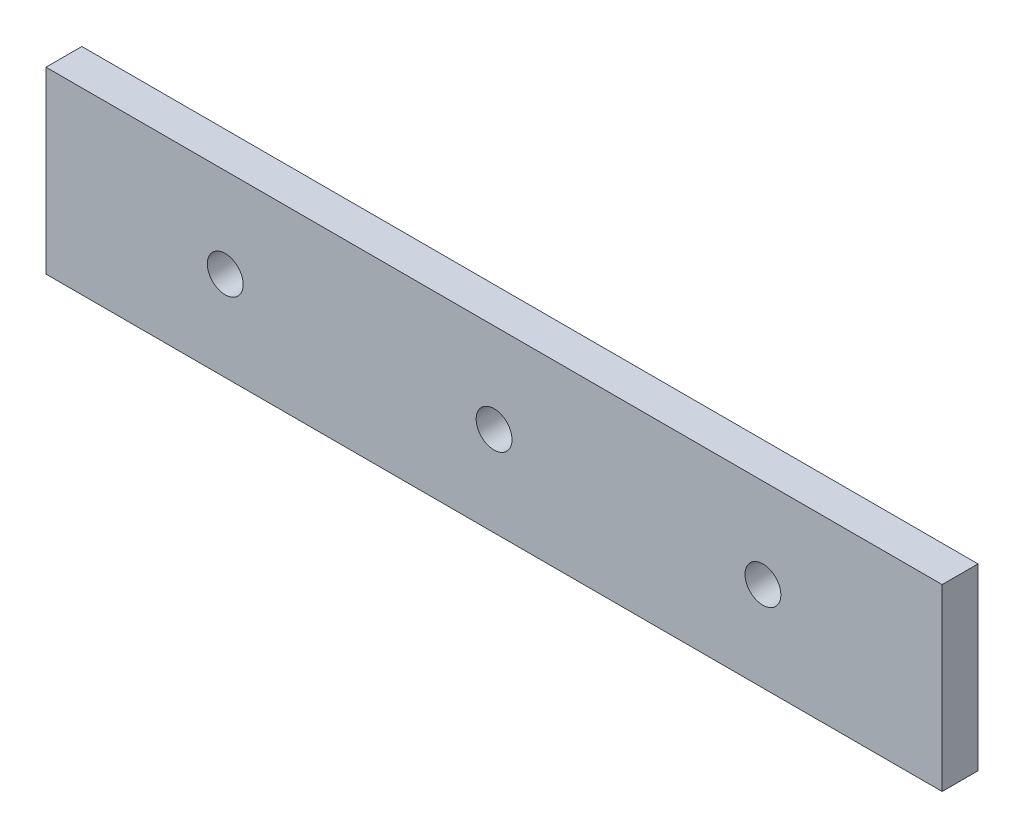
ISO-10303-21;
HEADER;
FILE_DESCRIPTION(('STEP AP214'),'2;1');
FILE_NAME('part.step','',(''),(''),'','','');
FILE_SCHEMA(('AUTOMOTIVE_DESIGN { 1 0 10303 214 1 1 1 1 }'));
ENDSEC;
DATA;
#1=APPLICATION_CONTEXT('core data for automotive mechanical design processes');
#2=APPLICATION_PROTOCOL_DEFINITION('international standard','automotive_design',2000,#1);
#3=PRODUCT_CONTEXT('',#1,'mechanical');
#4=PRODUCT('Part','Part','',(#3));
#5=PRODUCT_RELATED_PRODUCT_CATEGORY('part','',(#4));
#6=PRODUCT_DEFINITION_FORMATION('','',#4);
#7=PRODUCT_DEFINITION_CONTEXT('part definition',#1,'design');
#8=PRODUCT_DEFINITION('design','',#6,#7);
#9=PRODUCT_DEFINITION_SHAPE('','',#8);
#10=(LENGTH_UNIT() NAMED_UNIT(*) SI_UNIT(.MILLI.,.METRE.));
#11=(NAMED_UNIT(*) PLANE_ANGLE_UNIT() SI_UNIT($,.RADIAN.));
#12=(NAMED_UNIT(*) SI_UNIT($,.STERADIAN.) SOLID_ANGLE_UNIT());
#13=UNCERTAINTY_MEASURE_WITH_UNIT(LENGTH_MEASURE(1.E-05),#10,'distance_accuracy_value','');
#14=(GEOMETRIC_REPRESENTATION_CONTEXT(3) GLOBAL_UNCERTAINTY_ASSIGNED_CONTEXT((#13)) GLOBAL_UNIT_ASSIGNED_CONTEXT((#10,
#11,#12)) REPRESENTATION_CONTEXT('',''));
#15=CARTESIAN_POINT('',(0.,0.,0.));
#16=DIRECTION('',(0.,0.,1.));
#17=DIRECTION('',(1.,0.,0.));
#18=AXIS2_PLACEMENT_3D('',#15,#16,#17);
#19=CARTESIAN_POINT('',(0.,0.,3.));
#20=DIRECTION('',(0.,0.,-1.));
#21=DIRECTION('',(-1.,0.,0.));
#22=AXIS2_PLACEMENT_3D('',#19,#20,#21);
#23=PLANE('',#22);
#24=DIRECTION('',(0.,-1.,0.));
#25=VECTOR('',#24,1.);
#26=CARTESIAN_POINT('',(0.,0.,3.));
#27=LINE('',#26,#25);
#28=CARTESIAN_POINT('',(0.,15.,3.));
#29=VERTEX_POINT('',#28);
#30=CARTESIAN_POINT('',(0.,0.,3.));
#31=VERTEX_POINT('',#30);
#32=EDGE_CURVE('E85',#29,#31,#27,.T.);
#33=ORIENTED_EDGE('',*,*,#32,.T.);
#34=DIRECTION('',(1.,0.,0.));
#35=VECTOR('',#34,1.);
#36=CARTESIAN_POINT('',(0.,0.,3.));
#37=LINE('',#36,#35);
#38=CARTESIAN_POINT('',(75.,0.,3.));
#39=VERTEX_POINT('',#38);
#40=EDGE_CURVE('E80',#31,#39,#37,.T.);
#41=ORIENTED_EDGE('',*,*,#40,.T.);
#42=DIRECTION('',(0.,1.,0.));
#43=VECTOR('',#42,1.);
#44=CARTESIAN_POINT('',(75.,0.,3.));
#45=LINE('',#44,#43);
#46=CARTESIAN_POINT('',(75.,15.,3.));
#47=VERTEX_POINT('',#46);
#48=EDGE_CURVE('E83',#39,#47,#45,.T.);
#49=ORIENTED_EDGE('',*,*,#48,.T.);
#50=DIRECTION('',(-1.,0.,0.));
#51=VECTOR('',#50,1.);
#52=CARTESIAN_POINT('',(0.,15.,3.));
#53=LINE('',#52,#51);
#54=EDGE_CURVE('E50',#47,#29,#53,.T.);
#55=ORIENTED_EDGE('',*,*,#54,.T.);
#56=EDGE_LOOP('',(#33,#41,#49,#55));
#57=FACE_BOUND('',#56,.T.);
#58=CARTESIAN_POINT('',(15.,7.5,3.));
#59=DIRECTION('',(0.,0.,1.));
#60=DIRECTION('',(1.,0.,0.));
#61=AXIS2_PLACEMENT_3D('',#58,#59,#60);
#62=CIRCLE('',#61,1.5);
#63=CARTESIAN_POINT('',(16.5,7.5,3.));
#64=VERTEX_POINT('',#63);
#65=EDGE_CURVE('E100',#64,#64,#62,.T.);
#66=ORIENTED_EDGE('',*,*,#65,.F.);
#67=EDGE_LOOP('',(#66));
#68=FACE_BOUND('',#67,.T.);
#69=CARTESIAN_POINT('',(37.5,7.5,3.));
#70=DIRECTION('',(0.,0.,1.));
#71=DIRECTION('',(1.,0.,0.));
#72=AXIS2_PLACEMENT_3D('',#69,#70,#71);
#73=CIRCLE('',#72,1.5);
#74=CARTESIAN_POINT('',(39.,7.5,3.));
#75=VERTEX_POINT('',#74);
#76=EDGE_CURVE('E115',#75,#75,#73,.T.);
#77=ORIENTED_EDGE('',*,*,#76,.F.);
#78=EDGE_LOOP('',(#77));
#79=FACE_BOUND('',#78,.T.);
#80=CARTESIAN_POINT('',(60.,7.5,3.));
#81=DIRECTION('',(0.,0.,1.));
#82=DIRECTION('',(1.,0.,0.));
#83=AXIS2_PLACEMENT_3D('',#80,#81,#82);
#84=CIRCLE('',#83,1.5);
#85=CARTESIAN_POINT('',(61.5,7.5,3.));
#86=VERTEX_POINT('',#85);
#87=EDGE_CURVE('E121',#86,#86,#84,.T.);
#88=ORIENTED_EDGE('',*,*,#87,.F.);
#89=EDGE_LOOP('',(#88));
#90=FACE_BOUND('',#89,.T.);
#91=ADVANCED_FACE('F33',(#57,#68,#79,#90),#23,.F.);
#92=CARTESIAN_POINT('',(0.,0.,0.));
#93=DIRECTION('',(0.,0.,-1.));
#94=DIRECTION('',(-1.,0.,0.));
#95=AXIS2_PLACEMENT_3D('',#92,#93,#94);
#96=PLANE('',#95);
#97=CARTESIAN_POINT('',(37.5,7.5,0.));
#98=DIRECTION('',(0.,0.,1.));
#99=DIRECTION('',(1.,0.,0.));
#100=AXIS2_PLACEMENT_3D('',#97,#98,#99);
#101=CIRCLE('',#100,1.5);
#102=CARTESIAN_POINT('',(39.,7.5,0.));
#103=VERTEX_POINT('',#102);
#104=EDGE_CURVE('E118',#103,#103,#101,.T.);
#105=ORIENTED_EDGE('',*,*,#104,.T.);
#106=EDGE_LOOP('',(#105));
#107=FACE_BOUND('',#106,.T.);
#108=DIRECTION('',(0.,-1.,0.));
#109=VECTOR('',#108,1.);
#110=CARTESIAN_POINT('',(0.,0.,0.));
#111=LINE('',#110,#109);
#112=CARTESIAN_POINT('',(0.,15.,0.));
#113=VERTEX_POINT('',#112);
#114=CARTESIAN_POINT('',(0.,0.,0.));
#115=VERTEX_POINT('',#114);
#116=EDGE_CURVE('E97',#113,#115,#111,.T.);
#117=ORIENTED_EDGE('',*,*,#116,.F.);
#118=DIRECTION('',(-1.,0.,0.));
#119=VECTOR('',#118,1.);
#120=CARTESIAN_POINT('',(0.,15.,0.));
#121=LINE('',#120,#119);
#122=CARTESIAN_POINT('',(75.,15.,0.));
#123=VERTEX_POINT('',#122);
#124=EDGE_CURVE('E73',#123,#113,#121,.T.);
#125=ORIENTED_EDGE('',*,*,#124,.F.);
#126=DIRECTION('',(0.,1.,0.));
#127=VECTOR('',#126,1.);
#128=CARTESIAN_POINT('',(75.,0.,0.));
#129=LINE('',#128,#127);
#130=CARTESIAN_POINT('',(75.,0.,0.));
#131=VERTEX_POINT('',#130);
#132=EDGE_CURVE('E67',#131,#123,#129,.T.);
#133=ORIENTED_EDGE('',*,*,#132,.F.);
#134=DIRECTION('',(1.,0.,0.));
#135=VECTOR('',#134,1.);
#136=CARTESIAN_POINT('',(0.,0.,0.));
#137=LINE('',#136,#135);
#138=EDGE_CURVE('E89',#115,#131,#137,.T.);
#139=ORIENTED_EDGE('',*,*,#138,.F.);
#140=EDGE_LOOP('',(#117,#125,#133,#139));
#141=FACE_BOUND('',#140,.T.);
#142=CARTESIAN_POINT('',(15.,7.5,0.));
#143=DIRECTION('',(0.,0.,1.));
#144=DIRECTION('',(1.,0.,0.));
#145=AXIS2_PLACEMENT_3D('',#142,#143,#144);
#146=CIRCLE('',#145,1.5);
#147=CARTESIAN_POINT('',(16.5,7.5,0.));
#148=VERTEX_POINT('',#147);
#149=EDGE_CURVE('E112',#148,#148,#146,.T.);
#150=ORIENTED_EDGE('',*,*,#149,.T.);
#151=EDGE_LOOP('',(#150));
#152=FACE_BOUND('',#151,.T.);
#153=CARTESIAN_POINT('',(60.,7.5,0.));
#154=DIRECTION('',(0.,0.,1.));
#155=DIRECTION('',(1.,0.,0.));
#156=AXIS2_PLACEMENT_3D('',#153,#154,#155);
#157=CIRCLE('',#156,1.5);
#158=CARTESIAN_POINT('',(61.5,7.5,0.));
#159=VERTEX_POINT('',#158);
#160=EDGE_CURVE('E124',#159,#159,#157,.T.);
#161=ORIENTED_EDGE('',*,*,#160,.T.);
#162=EDGE_LOOP('',(#161));
#163=FACE_BOUND('',#162,.T.);
#164=ADVANCED_FACE('F108',(#107,#141,#152,#163),#96,.T.);
#165=CARTESIAN_POINT('',(0.,0.,3.));
#166=DIRECTION('',(1.,0.,0.));
#167=DIRECTION('',(0.,1.,0.));
#168=AXIS2_PLACEMENT_3D('',#165,#166,#167);
#169=PLANE('',#168);
#170=ORIENTED_EDGE('',*,*,#116,.T.);
#171=DIRECTION('',(0.,0.,-1.));
#172=VECTOR('',#171,1.);
#173=CARTESIAN_POINT('',(0.,0.,3.));
#174=LINE('',#173,#172);
#175=EDGE_CURVE('E11',#31,#115,#174,.T.);
#176=ORIENTED_EDGE('',*,*,#175,.F.);
#177=ORIENTED_EDGE('',*,*,#32,.F.);
#178=DIRECTION('',(0.,0.,-1.));
#179=VECTOR('',#178,1.);
#180=CARTESIAN_POINT('',(0.,15.,3.));
#181=LINE('',#180,#179);
#182=EDGE_CURVE('E93',#29,#113,#181,.T.);
#183=ORIENTED_EDGE('',*,*,#182,.T.);
#184=EDGE_LOOP('',(#170,#176,#177,#183));
#185=FACE_BOUND('',#184,.T.);
#186=ADVANCED_FACE('F35',(#185),#169,.F.);
#187=CARTESIAN_POINT('',(0.,0.,3.));
#188=DIRECTION('',(0.,1.,0.));
#189=DIRECTION('',(0.,0.,1.));
#190=AXIS2_PLACEMENT_3D('',#187,#188,#189);
#191=PLANE('',#190);
#192=ORIENTED_EDGE('',*,*,#138,.T.);
#193=DIRECTION('',(0.,0.,-1.));
#194=VECTOR('',#193,1.);
#195=CARTESIAN_POINT('',(75.,0.,3.));
#196=LINE('',#195,#194);
#197=EDGE_CURVE('E42',#39,#131,#196,.T.);
#198=ORIENTED_EDGE('',*,*,#197,.F.);
#199=ORIENTED_EDGE('',*,*,#40,.F.);
#200=ORIENTED_EDGE('',*,*,#175,.T.);
#201=EDGE_LOOP('',(#192,#198,#199,#200));
#202=FACE_BOUND('',#201,.T.);
#203=ADVANCED_FACE('F88',(#202),#191,.F.);
#204=CARTESIAN_POINT('',(75.,0.,3.));
#205=DIRECTION('',(-1.,0.,0.));
#206=DIRECTION('',(0.,-1.,0.));
#207=AXIS2_PLACEMENT_3D('',#204,#205,#206);
#208=PLANE('',#207);
#209=ORIENTED_EDGE('',*,*,#132,.T.);
#210=DIRECTION('',(0.,0.,-1.));
#211=VECTOR('',#210,1.);
#212=CARTESIAN_POINT('',(75.,15.,3.));
#213=LINE('',#212,#211);
#214=EDGE_CURVE('E90',#47,#123,#213,.T.);
#215=ORIENTED_EDGE('',*,*,#214,.F.);
#216=ORIENTED_EDGE('',*,*,#48,.F.);
#217=ORIENTED_EDGE('',*,*,#197,.T.);
#218=EDGE_LOOP('',(#209,#215,#216,#217));
#219=FACE_BOUND('',#218,.T.);
#220=ADVANCED_FACE('F91',(#219),#208,.F.);
#221=CARTESIAN_POINT('',(0.,15.,3.));
#222=DIRECTION('',(0.,-1.,0.));
#223=DIRECTION('',(0.,0.,-1.));
#224=AXIS2_PLACEMENT_3D('',#221,#222,#223);
#225=PLANE('',#224);
#226=ORIENTED_EDGE('',*,*,#124,.T.);
#227=ORIENTED_EDGE('',*,*,#182,.F.);
#228=ORIENTED_EDGE('',*,*,#54,.F.);
#229=ORIENTED_EDGE('',*,*,#214,.T.);
#230=EDGE_LOOP('',(#226,#227,#228,#229));
#231=FACE_BOUND('',#230,.T.);
#232=ADVANCED_FACE('F105',(#231),#225,.F.);
#233=CARTESIAN_POINT('',(15.,7.5,3.));
#234=DIRECTION('',(0.,0.,-1.));
#235=DIRECTION('',(-1.,0.,0.));
#236=AXIS2_PLACEMENT_3D('',#233,#234,#235);
#237=CYLINDRICAL_SURFACE('',#236,1.5);
#238=ORIENTED_EDGE('',*,*,#65,.T.);
#239=EDGE_LOOP('',(#238));
#240=FACE_BOUND('',#239,.T.);
#241=ORIENTED_EDGE('',*,*,#149,.F.);
#242=EDGE_LOOP('',(#241));
#243=FACE_BOUND('',#242,.T.);
#244=ADVANCED_FACE('F141',(#240,#243),#237,.F.);
#245=CARTESIAN_POINT('',(37.5,7.5,3.));
#246=DIRECTION('',(0.,0.,-1.));
#247=DIRECTION('',(-1.,0.,0.));
#248=AXIS2_PLACEMENT_3D('',#245,#246,#247);
#249=CYLINDRICAL_SURFACE('',#248,1.5);
#250=ORIENTED_EDGE('',*,*,#76,.T.);
#251=EDGE_LOOP('',(#250));
#252=FACE_BOUND('',#251,.T.);
#253=ORIENTED_EDGE('',*,*,#104,.F.);
#254=EDGE_LOOP('',(#253));
#255=FACE_BOUND('',#254,.T.);
#256=ADVANCED_FACE('F187',(#252,#255),#249,.F.);
#257=CARTESIAN_POINT('',(60.,7.5,3.));
#258=DIRECTION('',(0.,0.,-1.));
#259=DIRECTION('',(-1.,0.,0.));
#260=AXIS2_PLACEMENT_3D('',#257,#258,#259);
#261=CYLINDRICAL_SURFACE('',#260,1.5);
#262=ORIENTED_EDGE('',*,*,#87,.T.);
#263=EDGE_LOOP('',(#262));
#264=FACE_BOUND('',#263,.T.);
#265=ORIENTED_EDGE('',*,*,#160,.F.);
#266=EDGE_LOOP('',(#265));
#267=FACE_BOUND('',#266,.T.);
#268=ADVANCED_FACE('F130',(#264,#267),#261,.F.);
#269=CLOSED_SHELL('',(#91,#164,#186,#203,#220,#232,#244,#256,#268));
#270=MANIFOLD_SOLID_BREP('B2',#269);
#271=ADVANCED_BREP_SHAPE_REPRESENTATION('',(#18,#270),#14);
#272=SHAPE_DEFINITION_REPRESENTATION(#9,#271);
ENDSEC;
END-ISO-10303-21;
